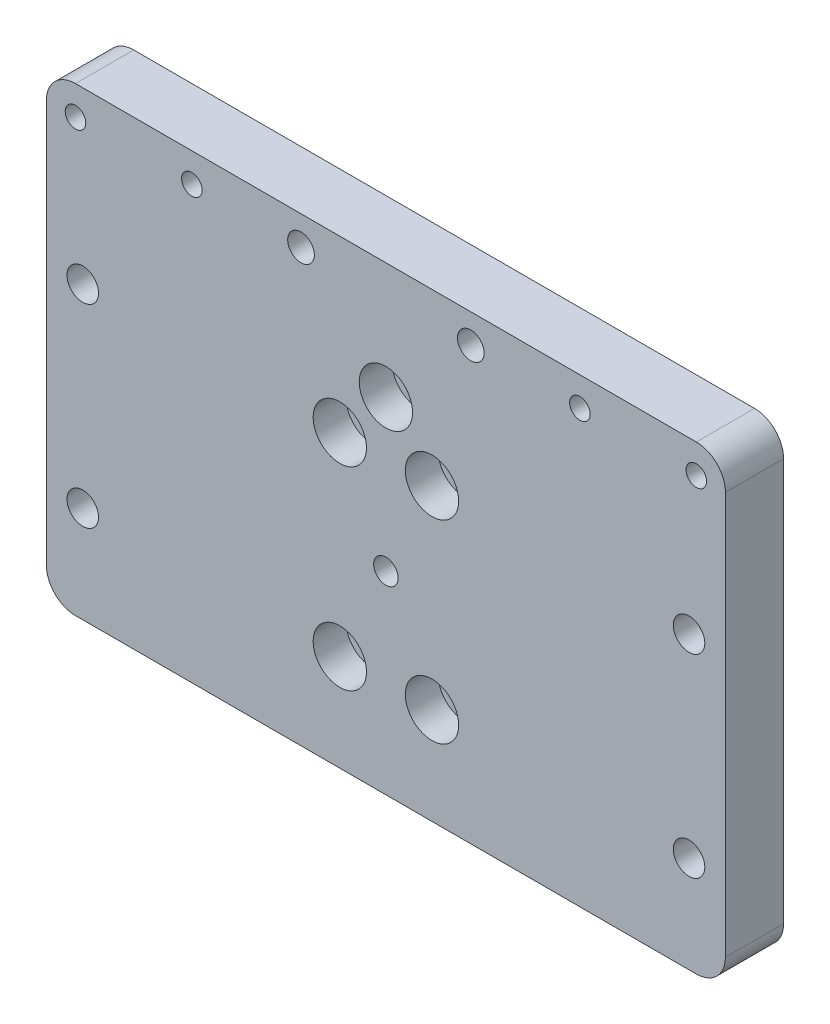
ISO-10303-21;
HEADER;
FILE_DESCRIPTION(('STEP AP214'),'2;1');
FILE_NAME('part.step','',(''),(''),'','','');
FILE_SCHEMA(('AUTOMOTIVE_DESIGN { 1 0 10303 214 1 1 1 1 }'));
ENDSEC;
DATA;
#1=APPLICATION_CONTEXT('core data for automotive mechanical design processes');
#2=APPLICATION_PROTOCOL_DEFINITION('international standard','automotive_design',2000,#1);
#3=PRODUCT_CONTEXT('',#1,'mechanical');
#4=PRODUCT('Part','Part','',(#3));
#5=PRODUCT_RELATED_PRODUCT_CATEGORY('part','',(#4));
#6=PRODUCT_DEFINITION_FORMATION('','',#4);
#7=PRODUCT_DEFINITION_CONTEXT('part definition',#1,'design');
#8=PRODUCT_DEFINITION('design','',#6,#7);
#9=PRODUCT_DEFINITION_SHAPE('','',#8);
#10=(LENGTH_UNIT() NAMED_UNIT(*) SI_UNIT(.MILLI.,.METRE.));
#11=(NAMED_UNIT(*) PLANE_ANGLE_UNIT() SI_UNIT($,.RADIAN.));
#12=(NAMED_UNIT(*) SI_UNIT($,.STERADIAN.) SOLID_ANGLE_UNIT());
#13=UNCERTAINTY_MEASURE_WITH_UNIT(LENGTH_MEASURE(1.E-05),#10,'distance_accuracy_value','');
#14=(GEOMETRIC_REPRESENTATION_CONTEXT(3) GLOBAL_UNCERTAINTY_ASSIGNED_CONTEXT((#13)) GLOBAL_UNIT_ASSIGNED_CONTEXT((#10,
#11,#12)) REPRESENTATION_CONTEXT('',''));
#15=CARTESIAN_POINT('',(0.,0.,0.));
#16=DIRECTION('',(0.,0.,1.));
#17=DIRECTION('',(1.,0.,0.));
#18=AXIS2_PLACEMENT_3D('',#15,#16,#17);
#19=CARTESIAN_POINT('',(2.37114451419452E-06,112.213628475702,51.0000000000025));
#20=DIRECTION('',(0.,0.,-1.));
#21=DIRECTION('',(-1.,0.,0.));
#22=AXIS2_PLACEMENT_3D('',#19,#20,#21);
#23=CYLINDRICAL_SURFACE('',#22,5.5);
#24=CARTESIAN_POINT('',(2.37114451427779E-06,112.213628475702,51.2000000000025));
#25=DIRECTION('',(0.,0.,-1.));
#26=DIRECTION('',(-1.,0.,0.));
#27=AXIS2_PLACEMENT_3D('',#24,#25,#26);
#28=CIRCLE('',#27,5.5);
#29=CARTESIAN_POINT('',(-5.49999762885549,112.213628475702,51.2000000000025));
#30=VERTEX_POINT('',#29);
#31=EDGE_CURVE('E19',#30,#30,#28,.F.);
#32=ORIENTED_EDGE('',*,*,#31,.F.);
#33=EDGE_LOOP('',(#32));
#34=FACE_BOUND('',#33,.T.);
#35=CARTESIAN_POINT('',(2.37114451710886E-06,112.213628475702,58.0000000000025));
#36=DIRECTION('',(0.,0.,-1.));
#37=DIRECTION('',(-1.,0.,0.));
#38=AXIS2_PLACEMENT_3D('',#35,#36,#37);
#39=CIRCLE('',#38,5.5);
#40=CARTESIAN_POINT('',(-5.49999762885548,112.213628475702,58.0000000000025));
#41=VERTEX_POINT('',#40);
#42=EDGE_CURVE('E243',#41,#41,#39,.T.);
#43=ORIENTED_EDGE('',*,*,#42,.F.);
#44=EDGE_LOOP('',(#43));
#45=FACE_BOUND('',#44,.T.);
#46=ADVANCED_FACE('F16',(#34,#45),#23,.F.);
#47=CARTESIAN_POINT('',(9.500000000003,61.1500000000002,56.0000000000026));
#48=DIRECTION('',(0.,0.,-1.));
#49=DIRECTION('',(-1.,0.,0.));
#50=AXIS2_PLACEMENT_3D('',#47,#48,#49);
#51=CYLINDRICAL_SURFACE('',#50,5.5);
#52=CARTESIAN_POINT('',(9.500000000003,61.1500000000002,51.2000000000026));
#53=DIRECTION('',(0.,0.,-1.));
#54=DIRECTION('',(-1.,0.,0.));
#55=AXIS2_PLACEMENT_3D('',#52,#53,#54);
#56=CIRCLE('',#55,5.5);
#57=CARTESIAN_POINT('',(4.000000000003,61.1500000000002,51.2000000000026));
#58=VERTEX_POINT('',#57);
#59=EDGE_CURVE('E251',#58,#58,#56,.F.);
#60=ORIENTED_EDGE('',*,*,#59,.F.);
#61=EDGE_LOOP('',(#60));
#62=FACE_BOUND('',#61,.T.);
#63=CARTESIAN_POINT('',(9.500000000003,61.1500000000002,58.0000000000026));
#64=DIRECTION('',(0.,0.,-1.));
#65=DIRECTION('',(-1.,0.,0.));
#66=AXIS2_PLACEMENT_3D('',#63,#64,#65);
#67=CIRCLE('',#66,5.5);
#68=CARTESIAN_POINT('',(4.000000000003,61.1500000000002,58.0000000000026));
#69=VERTEX_POINT('',#68);
#70=EDGE_CURVE('E237',#69,#69,#67,.T.);
#71=ORIENTED_EDGE('',*,*,#70,.F.);
#72=EDGE_LOOP('',(#71));
#73=FACE_BOUND('',#72,.T.);
#74=ADVANCED_FACE('F262',(#62,#73),#51,.F.);
#75=CARTESIAN_POINT('',(-9.50000000000292,101.15,56.0000000000026));
#76=DIRECTION('',(0.,0.,-1.));
#77=DIRECTION('',(-1.,0.,0.));
#78=AXIS2_PLACEMENT_3D('',#75,#76,#77);
#79=CYLINDRICAL_SURFACE('',#78,5.5);
#80=CARTESIAN_POINT('',(-9.50000000000292,101.15,51.2000000000026));
#81=DIRECTION('',(0.,0.,-1.));
#82=DIRECTION('',(-1.,0.,0.));
#83=AXIS2_PLACEMENT_3D('',#80,#81,#82);
#84=CIRCLE('',#83,5.5);
#85=CARTESIAN_POINT('',(-15.0000000000029,101.15,51.2000000000026));
#86=VERTEX_POINT('',#85);
#87=EDGE_CURVE('E249',#86,#86,#84,.F.);
#88=ORIENTED_EDGE('',*,*,#87,.F.);
#89=EDGE_LOOP('',(#88));
#90=FACE_BOUND('',#89,.T.);
#91=CARTESIAN_POINT('',(-9.50000000000292,101.15,58.0000000000026));
#92=DIRECTION('',(0.,0.,-1.));
#93=DIRECTION('',(-1.,0.,0.));
#94=AXIS2_PLACEMENT_3D('',#91,#92,#93);
#95=CIRCLE('',#94,5.5);
#96=CARTESIAN_POINT('',(-15.0000000000029,101.15,58.0000000000026));
#97=VERTEX_POINT('',#96);
#98=EDGE_CURVE('E234',#97,#97,#95,.T.);
#99=ORIENTED_EDGE('',*,*,#98,.F.);
#100=EDGE_LOOP('',(#99));
#101=FACE_BOUND('',#100,.T.);
#102=ADVANCED_FACE('F591',(#90,#101),#79,.F.);
#103=CARTESIAN_POINT('',(9.50000000000301,101.15,56.0000000000025));
#104=DIRECTION('',(0.,0.,-1.));
#105=DIRECTION('',(-1.,0.,0.));
#106=AXIS2_PLACEMENT_3D('',#103,#104,#105);
#107=CYLINDRICAL_SURFACE('',#106,5.5);
#108=CARTESIAN_POINT('',(9.50000000000301,101.15,51.2000000000025));
#109=DIRECTION('',(0.,0.,-1.));
#110=DIRECTION('',(-1.,0.,0.));
#111=AXIS2_PLACEMENT_3D('',#108,#109,#110);
#112=CIRCLE('',#111,5.5);
#113=CARTESIAN_POINT('',(4.00000000000301,101.15,51.2000000000025));
#114=VERTEX_POINT('',#113);
#115=EDGE_CURVE('E246',#114,#114,#112,.F.);
#116=ORIENTED_EDGE('',*,*,#115,.F.);
#117=EDGE_LOOP('',(#116));
#118=FACE_BOUND('',#117,.T.);
#119=CARTESIAN_POINT('',(9.50000000000301,101.15,58.0000000000026));
#120=DIRECTION('',(0.,0.,-1.));
#121=DIRECTION('',(-1.,0.,0.));
#122=AXIS2_PLACEMENT_3D('',#119,#120,#121);
#123=CIRCLE('',#122,5.5);
#124=CARTESIAN_POINT('',(4.00000000000301,101.15,58.0000000000026));
#125=VERTEX_POINT('',#124);
#126=EDGE_CURVE('E231',#125,#125,#123,.T.);
#127=ORIENTED_EDGE('',*,*,#126,.F.);
#128=EDGE_LOOP('',(#127));
#129=FACE_BOUND('',#128,.T.);
#130=ADVANCED_FACE('F582',(#118,#129),#107,.F.);
#131=CARTESIAN_POINT('',(-9.50000000000293,61.1500000000002,56.0000000000026));
#132=DIRECTION('',(0.,0.,-1.));
#133=DIRECTION('',(-1.,0.,0.));
#134=AXIS2_PLACEMENT_3D('',#131,#132,#133);
#135=CYLINDRICAL_SURFACE('',#134,5.5);
#136=CARTESIAN_POINT('',(-9.50000000000293,61.1500000000002,51.2000000000026));
#137=DIRECTION('',(0.,0.,-1.));
#138=DIRECTION('',(-1.,0.,0.));
#139=AXIS2_PLACEMENT_3D('',#136,#137,#138);
#140=CIRCLE('',#139,5.5);
#141=CARTESIAN_POINT('',(-15.0000000000029,61.1500000000002,51.2000000000026));
#142=VERTEX_POINT('',#141);
#143=EDGE_CURVE('E91',#142,#142,#140,.F.);
#144=ORIENTED_EDGE('',*,*,#143,.F.);
#145=EDGE_LOOP('',(#144));
#146=FACE_BOUND('',#145,.T.);
#147=CARTESIAN_POINT('',(-9.50000000000293,61.1500000000002,58.0000000000026));
#148=DIRECTION('',(0.,0.,-1.));
#149=DIRECTION('',(-1.,0.,0.));
#150=AXIS2_PLACEMENT_3D('',#147,#148,#149);
#151=CIRCLE('',#150,5.5);
#152=CARTESIAN_POINT('',(-15.0000000000029,61.1500000000002,58.0000000000026));
#153=VERTEX_POINT('',#152);
#154=EDGE_CURVE('E240',#153,#153,#151,.T.);
#155=ORIENTED_EDGE('',*,*,#154,.F.);
#156=EDGE_LOOP('',(#155));
#157=FACE_BOUND('',#156,.T.);
#158=ADVANCED_FACE('F573',(#146,#157),#135,.F.);
#159=CARTESIAN_POINT('',(0.,86.6818142378511,51.2000000000026));
#160=DIRECTION('',(0.,0.,1.));
#161=DIRECTION('',(0.,-1.,0.));
#162=AXIS2_PLACEMENT_3D('',#159,#160,#161);
#163=PLANE('',#162);
#164=CARTESIAN_POINT('',(2.37114451455141E-06,112.213628475702,51.2000000000025));
#165=DIRECTION('',(0.,0.,1.));
#166=DIRECTION('',(0.,-1.,0.));
#167=AXIS2_PLACEMENT_3D('',#164,#165,#166);
#168=CIRCLE('',#167,2.75);
#169=CARTESIAN_POINT('',(2.37114451455141E-06,109.463628475702,51.2000000000025));
#170=VERTEX_POINT('',#169);
#171=EDGE_CURVE('E220',#170,#170,#168,.F.);
#172=ORIENTED_EDGE('',*,*,#171,.T.);
#173=EDGE_LOOP('',(#172));
#174=FACE_BOUND('',#173,.T.);
#175=ORIENTED_EDGE('',*,*,#31,.T.);
#176=EDGE_LOOP('',(#175));
#177=FACE_BOUND('',#176,.T.);
#178=ADVANCED_FACE('F258',(#174,#177),#163,.T.);
#179=CARTESIAN_POINT('',(0.,86.6818142378511,51.2000000000026));
#180=DIRECTION('',(0.,0.,1.));
#181=DIRECTION('',(0.,-1.,0.));
#182=AXIS2_PLACEMENT_3D('',#179,#180,#181);
#183=PLANE('',#182);
#184=CARTESIAN_POINT('',(9.500000000003,61.1500000000002,51.2000000000026));
#185=DIRECTION('',(0.,0.,1.));
#186=DIRECTION('',(0.,-1.,0.));
#187=AXIS2_PLACEMENT_3D('',#184,#185,#186);
#188=CIRCLE('',#187,3.25);
#189=CARTESIAN_POINT('',(9.500000000003,57.9000000000002,51.2000000000026));
#190=VERTEX_POINT('',#189);
#191=EDGE_CURVE('E211',#190,#190,#188,.F.);
#192=ORIENTED_EDGE('',*,*,#191,.T.);
#193=EDGE_LOOP('',(#192));
#194=FACE_BOUND('',#193,.T.);
#195=ORIENTED_EDGE('',*,*,#59,.T.);
#196=EDGE_LOOP('',(#195));
#197=FACE_BOUND('',#196,.T.);
#198=ADVANCED_FACE('F556',(#194,#197),#183,.T.);
#199=CARTESIAN_POINT('',(0.,86.6818142378511,51.2000000000026));
#200=DIRECTION('',(0.,0.,1.));
#201=DIRECTION('',(0.,-1.,0.));
#202=AXIS2_PLACEMENT_3D('',#199,#200,#201);
#203=PLANE('',#202);
#204=CARTESIAN_POINT('',(-9.50000000000293,101.15,51.2000000000026));
#205=DIRECTION('',(0.,0.,1.));
#206=DIRECTION('',(0.,-1.,0.));
#207=AXIS2_PLACEMENT_3D('',#204,#205,#206);
#208=CIRCLE('',#207,3.25);
#209=CARTESIAN_POINT('',(-9.50000000000293,97.9,51.2000000000026));
#210=VERTEX_POINT('',#209);
#211=EDGE_CURVE('E196',#210,#210,#208,.F.);
#212=ORIENTED_EDGE('',*,*,#211,.T.);
#213=EDGE_LOOP('',(#212));
#214=FACE_BOUND('',#213,.T.);
#215=ORIENTED_EDGE('',*,*,#87,.T.);
#216=EDGE_LOOP('',(#215));
#217=FACE_BOUND('',#216,.T.);
#218=ADVANCED_FACE('F277',(#214,#217),#203,.T.);
#219=CARTESIAN_POINT('',(0.,86.6818142378511,51.2000000000026));
#220=DIRECTION('',(0.,0.,1.));
#221=DIRECTION('',(0.,-1.,0.));
#222=AXIS2_PLACEMENT_3D('',#219,#220,#221);
#223=PLANE('',#222);
#224=CARTESIAN_POINT('',(9.500000000003,101.15,51.2000000000025));
#225=DIRECTION('',(0.,0.,1.));
#226=DIRECTION('',(0.,-1.,0.));
#227=AXIS2_PLACEMENT_3D('',#224,#225,#226);
#228=CIRCLE('',#227,3.25);
#229=CARTESIAN_POINT('',(9.500000000003,97.9,51.2000000000025));
#230=VERTEX_POINT('',#229);
#231=EDGE_CURVE('E184',#230,#230,#228,.F.);
#232=ORIENTED_EDGE('',*,*,#231,.T.);
#233=EDGE_LOOP('',(#232));
#234=FACE_BOUND('',#233,.T.);
#235=ORIENTED_EDGE('',*,*,#115,.T.);
#236=EDGE_LOOP('',(#235));
#237=FACE_BOUND('',#236,.T.);
#238=ADVANCED_FACE('F267',(#234,#237),#223,.T.);
#239=CARTESIAN_POINT('',(2.37114450963889E-06,88.6819208628626,58.0000000000026));
#240=DIRECTION('',(0.,0.,1.));
#241=DIRECTION('',(0.,-1.,0.));
#242=AXIS2_PLACEMENT_3D('',#239,#240,#241);
#243=PLANE('',#242);
#244=CARTESIAN_POINT('',(62.500000000003,61.1500000000002,58.0000000000026));
#245=DIRECTION('',(0.,0.,1.));
#246=DIRECTION('',(0.,-1.,0.));
#247=AXIS2_PLACEMENT_3D('',#244,#245,#246);
#248=CIRCLE('',#247,3.25);
#249=CARTESIAN_POINT('',(62.500000000003,57.9000000000002,58.0000000000026));
#250=VERTEX_POINT('',#249);
#251=EDGE_CURVE('E178',#250,#250,#248,.F.);
#252=ORIENTED_EDGE('',*,*,#251,.T.);
#253=EDGE_LOOP('',(#252));
#254=FACE_BOUND('',#253,.T.);
#255=CARTESIAN_POINT('',(-39.9999976288555,130.213999908655,58.0000000000025));
#256=DIRECTION('',(0.,0.,1.));
#257=DIRECTION('',(0.,-1.,0.));
#258=AXIS2_PLACEMENT_3D('',#255,#256,#257);
#259=CIRCLE('',#258,2.117);
#260=CARTESIAN_POINT('',(-39.9999976288555,128.096999908655,58.0000000000025));
#261=VERTEX_POINT('',#260);
#262=EDGE_CURVE('E181',#261,#261,#259,.F.);
#263=ORIENTED_EDGE('',*,*,#262,.T.);
#264=EDGE_LOOP('',(#263));
#265=FACE_BOUND('',#264,.T.);
#266=CARTESIAN_POINT('',(40.0000023711445,130.213999908655,58.0000000000025));
#267=DIRECTION('',(0.,0.,1.));
#268=DIRECTION('',(0.,-1.,0.));
#269=AXIS2_PLACEMENT_3D('',#266,#267,#268);
#270=CIRCLE('',#269,2.117);
#271=CARTESIAN_POINT('',(40.0000023711445,128.096999908655,58.0000000000025));
#272=VERTEX_POINT('',#271);
#273=EDGE_CURVE('E187',#272,#272,#270,.F.);
#274=ORIENTED_EDGE('',*,*,#273,.T.);
#275=EDGE_LOOP('',(#274));
#276=FACE_BOUND('',#275,.T.);
#277=CARTESIAN_POINT('',(-62.5000000000029,61.1500000000002,58.0000000000026));
#278=DIRECTION('',(0.,0.,1.));
#279=DIRECTION('',(0.,-1.,0.));
#280=AXIS2_PLACEMENT_3D('',#277,#278,#279);
#281=CIRCLE('',#280,3.25);
#282=CARTESIAN_POINT('',(-62.5000000000029,57.9000000000002,58.0000000000026));
#283=VERTEX_POINT('',#282);
#284=EDGE_CURVE('E190',#283,#283,#281,.F.);
#285=ORIENTED_EDGE('',*,*,#284,.T.);
#286=EDGE_LOOP('',(#285));
#287=FACE_BOUND('',#286,.T.);
#288=CARTESIAN_POINT('',(-63.9999976288555,130.2139998831,58.0000000000026));
#289=DIRECTION('',(0.,0.,1.));
#290=DIRECTION('',(0.,-1.,0.));
#291=AXIS2_PLACEMENT_3D('',#288,#289,#290);
#292=CIRCLE('',#291,2.117);
#293=CARTESIAN_POINT('',(-63.9999976288555,128.0969998831,58.0000000000026));
#294=VERTEX_POINT('',#293);
#295=EDGE_CURVE('E193',#294,#294,#292,.F.);
#296=ORIENTED_EDGE('',*,*,#295,.T.);
#297=EDGE_LOOP('',(#296));
#298=FACE_BOUND('',#297,.T.);
#299=CARTESIAN_POINT('',(62.500000000003,101.15,58.0000000000025));
#300=DIRECTION('',(0.,0.,1.));
#301=DIRECTION('',(0.,-1.,0.));
#302=AXIS2_PLACEMENT_3D('',#299,#300,#301);
#303=CIRCLE('',#302,3.25);
#304=CARTESIAN_POINT('',(62.500000000003,97.9,58.0000000000025));
#305=VERTEX_POINT('',#304);
#306=EDGE_CURVE('E199',#305,#305,#303,.F.);
#307=ORIENTED_EDGE('',*,*,#306,.T.);
#308=EDGE_LOOP('',(#307));
#309=FACE_BOUND('',#308,.T.);
#310=CARTESIAN_POINT('',(-62.5000000000029,101.15,58.0000000000026));
#311=DIRECTION('',(0.,0.,1.));
#312=DIRECTION('',(0.,-1.,0.));
#313=AXIS2_PLACEMENT_3D('',#310,#311,#312);
#314=CIRCLE('',#313,3.25);
#315=CARTESIAN_POINT('',(-62.5000000000029,97.9,58.0000000000026));
#316=VERTEX_POINT('',#315);
#317=EDGE_CURVE('E202',#316,#316,#314,.F.);
#318=ORIENTED_EDGE('',*,*,#317,.T.);
#319=EDGE_LOOP('',(#318));
#320=FACE_BOUND('',#319,.T.);
#321=CARTESIAN_POINT('',(2.37114451325673E-06,81.1502132500234,58.0000000000026));
#322=DIRECTION('',(0.,0.,1.));
#323=DIRECTION('',(0.,-1.,0.));
#324=AXIS2_PLACEMENT_3D('',#321,#322,#323);
#325=CIRCLE('',#324,2.5175);
#326=CARTESIAN_POINT('',(2.37114451325673E-06,78.6327132500234,58.0000000000026));
#327=VERTEX_POINT('',#326);
#328=EDGE_CURVE('E205',#327,#327,#325,.F.);
#329=ORIENTED_EDGE('',*,*,#328,.T.);
#330=EDGE_LOOP('',(#329));
#331=FACE_BOUND('',#330,.T.);
#332=CARTESIAN_POINT('',(64.0000023711445,130.2139998831,58.0000000000025));
#333=DIRECTION('',(0.,0.,1.));
#334=DIRECTION('',(0.,-1.,0.));
#335=AXIS2_PLACEMENT_3D('',#332,#333,#334);
#336=CIRCLE('',#335,2.117);
#337=CARTESIAN_POINT('',(64.0000023711445,128.0969998831,58.0000000000025));
#338=VERTEX_POINT('',#337);
#339=EDGE_CURVE('E208',#338,#338,#336,.F.);
#340=ORIENTED_EDGE('',*,*,#339,.T.);
#341=EDGE_LOOP('',(#340));
#342=FACE_BOUND('',#341,.T.);
#343=ORIENTED_EDGE('',*,*,#126,.T.);
#344=EDGE_LOOP('',(#343));
#345=FACE_BOUND('',#344,.T.);
#346=ORIENTED_EDGE('',*,*,#98,.T.);
#347=EDGE_LOOP('',(#346));
#348=FACE_BOUND('',#347,.T.);
#349=ORIENTED_EDGE('',*,*,#70,.T.);
#350=EDGE_LOOP('',(#349));
#351=FACE_BOUND('',#350,.T.);
#352=ORIENTED_EDGE('',*,*,#154,.T.);
#353=EDGE_LOOP('',(#352));
#354=FACE_BOUND('',#353,.T.);
#355=CARTESIAN_POINT('',(17.5000023711445,130.213628475702,58.0000000000025));
#356=DIRECTION('',(0.,0.,1.));
#357=DIRECTION('',(0.,-1.,0.));
#358=AXIS2_PLACEMENT_3D('',#355,#356,#357);
#359=CIRCLE('',#358,2.75);
#360=CARTESIAN_POINT('',(17.5000023711445,127.463628475702,58.0000000000025));
#361=VERTEX_POINT('',#360);
#362=EDGE_CURVE('E214',#361,#361,#359,.F.);
#363=ORIENTED_EDGE('',*,*,#362,.T.);
#364=EDGE_LOOP('',(#363));
#365=FACE_BOUND('',#364,.T.);
#366=CARTESIAN_POINT('',(-17.4999976288555,130.213628475702,58.0000000000025));
#367=DIRECTION('',(0.,0.,1.));
#368=DIRECTION('',(0.,-1.,0.));
#369=AXIS2_PLACEMENT_3D('',#366,#367,#368);
#370=CIRCLE('',#369,2.75);
#371=CARTESIAN_POINT('',(-17.4999976288555,127.463628475702,58.0000000000025));
#372=VERTEX_POINT('',#371);
#373=EDGE_CURVE('E217',#372,#372,#370,.F.);
#374=ORIENTED_EDGE('',*,*,#373,.T.);
#375=EDGE_LOOP('',(#374));
#376=FACE_BOUND('',#375,.T.);
#377=ORIENTED_EDGE('',*,*,#42,.T.);
#378=EDGE_LOOP('',(#377));
#379=FACE_BOUND('',#378,.T.);
#380=CARTESIAN_POINT('',(-63.9999976288555,47.2132132500234,58.0000000000026));
#381=DIRECTION('',(0.,0.,-1.));
#382=DIRECTION('',(0.,1.,0.));
#383=AXIS2_PLACEMENT_3D('',#380,#381,#382);
#384=CIRCLE('',#383,6.);
#385=CARTESIAN_POINT('',(-63.9999976288555,41.2132132500234,58.0000000000026));
#386=VERTEX_POINT('',#385);
#387=CARTESIAN_POINT('',(-69.9999976288555,47.2132132500234,58.0000000000026));
#388=VERTEX_POINT('',#387);
#389=EDGE_CURVE('E225',#386,#388,#384,.T.);
#390=ORIENTED_EDGE('',*,*,#389,.F.);
#391=DIRECTION('',(1.,0.,0.));
#392=VECTOR('',#391,1.);
#393=CARTESIAN_POINT('',(-69.9999976288555,41.2132132500234,58.0000000000026));
#394=LINE('',#393,#392);
#395=CARTESIAN_POINT('',(64.0000023711446,41.2132132500234,58.0000000000026));
#396=VERTEX_POINT('',#395);
#397=EDGE_CURVE('E107',#396,#386,#394,.F.);
#398=ORIENTED_EDGE('',*,*,#397,.F.);
#399=CARTESIAN_POINT('',(64.0000023711446,47.2132132500234,58.0000000000026));
#400=DIRECTION('',(0.,0.,1.));
#401=DIRECTION('',(0.,-1.,0.));
#402=AXIS2_PLACEMENT_3D('',#399,#400,#401);
#403=CIRCLE('',#402,6.);
#404=CARTESIAN_POINT('',(70.0000023711446,47.2132132500234,58.0000000000026));
#405=VERTEX_POINT('',#404);
#406=EDGE_CURVE('E85',#405,#396,#403,.F.);
#407=ORIENTED_EDGE('',*,*,#406,.F.);
#408=DIRECTION('',(0.,1.,0.));
#409=VECTOR('',#408,1.);
#410=CARTESIAN_POINT('',(70.0000023711446,41.1502132500234,58.0000000000025));
#411=LINE('',#410,#409);
#412=CARTESIAN_POINT('',(70.0000023711445,130.213628475702,58.0000000000025));
#413=VERTEX_POINT('',#412);
#414=EDGE_CURVE('E81',#413,#405,#411,.F.);
#415=ORIENTED_EDGE('',*,*,#414,.F.);
#416=CARTESIAN_POINT('',(64.0000023711445,130.213628475702,58.0000000000025));
#417=DIRECTION('',(0.,0.,1.));
#418=DIRECTION('',(0.,-1.,0.));
#419=AXIS2_PLACEMENT_3D('',#416,#417,#418);
#420=CIRCLE('',#419,6.);
#421=CARTESIAN_POINT('',(64.0000023711445,136.213628475702,58.0000000000025));
#422=VERTEX_POINT('',#421);
#423=EDGE_CURVE('E78',#422,#413,#420,.F.);
#424=ORIENTED_EDGE('',*,*,#423,.F.);
#425=DIRECTION('',(1.,0.,0.));
#426=VECTOR('',#425,1.);
#427=CARTESIAN_POINT('',(70.0000023711445,136.213628475702,58.0000000000025));
#428=LINE('',#427,#426);
#429=CARTESIAN_POINT('',(-63.9999976288555,136.213628475702,58.0000000000025));
#430=VERTEX_POINT('',#429);
#431=EDGE_CURVE('E115',#430,#422,#428,.T.);
#432=ORIENTED_EDGE('',*,*,#431,.F.);
#433=CARTESIAN_POINT('',(-63.9999976288555,130.213628475702,58.0000000000025));
#434=DIRECTION('',(0.,0.,1.));
#435=DIRECTION('',(0.,-1.,0.));
#436=AXIS2_PLACEMENT_3D('',#433,#434,#435);
#437=CIRCLE('',#436,6.);
#438=CARTESIAN_POINT('',(-69.9999976288555,130.213628475702,58.0000000000026));
#439=VERTEX_POINT('',#438);
#440=EDGE_CURVE('E114',#439,#430,#437,.F.);
#441=ORIENTED_EDGE('',*,*,#440,.F.);
#442=DIRECTION('',(0.,1.,0.));
#443=VECTOR('',#442,1.);
#444=CARTESIAN_POINT('',(-69.9999976288555,136.213628475702,58.0000000000026));
#445=LINE('',#444,#443);
#446=EDGE_CURVE('E111',#388,#439,#445,.T.);
#447=ORIENTED_EDGE('',*,*,#446,.F.);
#448=EDGE_LOOP('',(#390,#398,#407,#415,#424,#432,#441,#447));
#449=FACE_BOUND('',#448,.T.);
#450=ADVANCED_FACE('F83',(#254,#265,#276,#287,#298,#309,#320,#331,#342,#345,#348,#351,#354,#365,
#376,#379,#449),#243,.T.);
#451=CARTESIAN_POINT('',(0.,86.6818142378511,51.2000000000026));
#452=DIRECTION('',(0.,0.,1.));
#453=DIRECTION('',(0.,-1.,0.));
#454=AXIS2_PLACEMENT_3D('',#451,#452,#453);
#455=PLANE('',#454);
#456=CARTESIAN_POINT('',(-9.50000000000293,61.1500000000002,51.2000000000026));
#457=DIRECTION('',(0.,0.,1.));
#458=DIRECTION('',(0.,-1.,0.));
#459=AXIS2_PLACEMENT_3D('',#456,#457,#458);
#460=CIRCLE('',#459,3.25);
#461=CARTESIAN_POINT('',(-9.50000000000293,57.9000000000002,51.2000000000026));
#462=VERTEX_POINT('',#461);
#463=EDGE_CURVE('E175',#462,#462,#460,.F.);
#464=ORIENTED_EDGE('',*,*,#463,.T.);
#465=EDGE_LOOP('',(#464));
#466=FACE_BOUND('',#465,.T.);
#467=ORIENTED_EDGE('',*,*,#143,.T.);
#468=EDGE_LOOP('',(#467));
#469=FACE_BOUND('',#468,.T.);
#470=ADVANCED_FACE('F266',(#466,#469),#455,.T.);
#471=CARTESIAN_POINT('',(70.0000023711446,41.1502132500234,46.0000000000026));
#472=DIRECTION('',(1.,0.,0.));
#473=DIRECTION('',(0.,1.,0.));
#474=AXIS2_PLACEMENT_3D('',#471,#472,#473);
#475=PLANE('',#474);
#476=DIRECTION('',(0.,0.,1.));
#477=VECTOR('',#476,1.);
#478=CARTESIAN_POINT('',(70.0000023711445,130.213628475702,46.0000000000025));
#479=LINE('',#478,#477);
#480=CARTESIAN_POINT('',(70.0000023711446,130.213628475702,46.0000000000025));
#481=VERTEX_POINT('',#480);
#482=EDGE_CURVE('E90',#413,#481,#479,.F.);
#483=ORIENTED_EDGE('',*,*,#482,.F.);
#484=ORIENTED_EDGE('',*,*,#414,.T.);
#485=DIRECTION('',(0.,0.,1.));
#486=VECTOR('',#485,1.);
#487=CARTESIAN_POINT('',(70.0000023711446,47.2132132500234,46.0000000000026));
#488=LINE('',#487,#486);
#489=CARTESIAN_POINT('',(70.0000023711446,47.2132132500234,46.0000000000026));
#490=VERTEX_POINT('',#489);
#491=EDGE_CURVE('E223',#490,#405,#488,.T.);
#492=ORIENTED_EDGE('',*,*,#491,.F.);
#493=DIRECTION('',(0.,-1.,0.));
#494=VECTOR('',#493,1.);
#495=CARTESIAN_POINT('',(70.0000023711446,88.6819208628626,46.0000000000026));
#496=LINE('',#495,#494);
#497=EDGE_CURVE('E102',#490,#481,#496,.F.);
#498=ORIENTED_EDGE('',*,*,#497,.T.);
#499=EDGE_LOOP('',(#483,#484,#492,#498));
#500=FACE_BOUND('',#499,.T.);
#501=ADVANCED_FACE('F101',(#500),#475,.T.);
#502=CARTESIAN_POINT('',(64.0000023711445,130.213628475702,46.0000000000025));
#503=DIRECTION('',(0.,0.,1.));
#504=DIRECTION('',(0.,-1.,0.));
#505=AXIS2_PLACEMENT_3D('',#502,#503,#504);
#506=CYLINDRICAL_SURFACE('',#505,6.);
#507=DIRECTION('',(0.,0.,1.));
#508=VECTOR('',#507,1.);
#509=CARTESIAN_POINT('',(64.0000023711445,136.213628475702,46.0000000000025));
#510=LINE('',#509,#508);
#511=CARTESIAN_POINT('',(64.0000023711445,136.213628475702,46.0000000000025));
#512=VERTEX_POINT('',#511);
#513=EDGE_CURVE('E98',#422,#512,#510,.F.);
#514=ORIENTED_EDGE('',*,*,#513,.F.);
#515=ORIENTED_EDGE('',*,*,#423,.T.);
#516=ORIENTED_EDGE('',*,*,#482,.T.);
#517=CARTESIAN_POINT('',(64.0000023711445,130.213628475702,46.0000000000025));
#518=DIRECTION('',(0.,0.,1.));
#519=DIRECTION('',(0.,-1.,0.));
#520=AXIS2_PLACEMENT_3D('',#517,#518,#519);
#521=CIRCLE('',#520,6.);
#522=EDGE_CURVE('E173',#481,#512,#521,.T.);
#523=ORIENTED_EDGE('',*,*,#522,.T.);
#524=EDGE_LOOP('',(#514,#515,#516,#523));
#525=FACE_BOUND('',#524,.T.);
#526=ADVANCED_FACE('F95',(#525),#506,.T.);
#527=CARTESIAN_POINT('',(70.0000023711445,136.213628475702,46.0000000000025));
#528=DIRECTION('',(0.,1.,0.));
#529=DIRECTION('',(0.,0.,1.));
#530=AXIS2_PLACEMENT_3D('',#527,#528,#529);
#531=PLANE('',#530);
#532=DIRECTION('',(0.,0.,1.));
#533=VECTOR('',#532,1.);
#534=CARTESIAN_POINT('',(-63.9999976288555,136.213628475702,46.0000000000025));
#535=LINE('',#534,#533);
#536=CARTESIAN_POINT('',(-63.9999976288555,136.213628475702,46.0000000000025));
#537=VERTEX_POINT('',#536);
#538=EDGE_CURVE('E116',#430,#537,#535,.F.);
#539=ORIENTED_EDGE('',*,*,#538,.F.);
#540=ORIENTED_EDGE('',*,*,#431,.T.);
#541=ORIENTED_EDGE('',*,*,#513,.T.);
#542=DIRECTION('',(1.,0.,0.));
#543=VECTOR('',#542,1.);
#544=CARTESIAN_POINT('',(2.37114450408777E-06,136.213628475702,46.0000000000026));
#545=LINE('',#544,#543);
#546=EDGE_CURVE('E172',#512,#537,#545,.F.);
#547=ORIENTED_EDGE('',*,*,#546,.T.);
#548=EDGE_LOOP('',(#539,#540,#541,#547));
#549=FACE_BOUND('',#548,.T.);
#550=ADVANCED_FACE('F372',(#549),#531,.T.);
#551=CARTESIAN_POINT('',(-63.9999976288555,130.213628475702,46.0000000000025));
#552=DIRECTION('',(0.,0.,1.));
#553=DIRECTION('',(0.,-1.,0.));
#554=AXIS2_PLACEMENT_3D('',#551,#552,#553);
#555=CYLINDRICAL_SURFACE('',#554,6.);
#556=DIRECTION('',(0.,0.,1.));
#557=VECTOR('',#556,1.);
#558=CARTESIAN_POINT('',(-69.9999976288555,130.213628475702,46.0000000000025));
#559=LINE('',#558,#557);
#560=CARTESIAN_POINT('',(-69.9999976288555,130.213628475702,46.0000000000025));
#561=VERTEX_POINT('',#560);
#562=EDGE_CURVE('E113',#439,#561,#559,.F.);
#563=ORIENTED_EDGE('',*,*,#562,.F.);
#564=ORIENTED_EDGE('',*,*,#440,.T.);
#565=ORIENTED_EDGE('',*,*,#538,.T.);
#566=CARTESIAN_POINT('',(-63.9999976288555,130.213628475702,46.0000000000025));
#567=DIRECTION('',(0.,0.,1.));
#568=DIRECTION('',(0.,-1.,0.));
#569=AXIS2_PLACEMENT_3D('',#566,#567,#568);
#570=CIRCLE('',#569,6.);
#571=EDGE_CURVE('E169',#537,#561,#570,.T.);
#572=ORIENTED_EDGE('',*,*,#571,.T.);
#573=EDGE_LOOP('',(#563,#564,#565,#572));
#574=FACE_BOUND('',#573,.T.);
#575=ADVANCED_FACE('F368',(#574),#555,.T.);
#576=CARTESIAN_POINT('',(-69.9999976288555,136.213628475702,46.0000000000025));
#577=DIRECTION('',(-1.,0.,0.));
#578=DIRECTION('',(0.,0.,1.));
#579=AXIS2_PLACEMENT_3D('',#576,#577,#578);
#580=PLANE('',#579);
#581=ORIENTED_EDGE('',*,*,#562,.T.);
#582=DIRECTION('',(0.,-1.,0.));
#583=VECTOR('',#582,1.);
#584=CARTESIAN_POINT('',(-69.9999976288555,88.6819208628626,46.0000000000026));
#585=LINE('',#584,#583);
#586=CARTESIAN_POINT('',(-69.9999976288555,47.2132132500234,46.0000000000026));
#587=VERTEX_POINT('',#586);
#588=EDGE_CURVE('E168',#561,#587,#585,.T.);
#589=ORIENTED_EDGE('',*,*,#588,.T.);
#590=DIRECTION('',(0.,0.,-1.));
#591=VECTOR('',#590,1.);
#592=CARTESIAN_POINT('',(-69.9999976288555,47.2132132500234,46.0000000000026));
#593=LINE('',#592,#591);
#594=EDGE_CURVE('E110',#388,#587,#593,.T.);
#595=ORIENTED_EDGE('',*,*,#594,.F.);
#596=ORIENTED_EDGE('',*,*,#446,.T.);
#597=EDGE_LOOP('',(#581,#589,#595,#596));
#598=FACE_BOUND('',#597,.T.);
#599=ADVANCED_FACE('F364',(#598),#580,.T.);
#600=CARTESIAN_POINT('',(-63.9999976288555,47.2132132500234,46.0000000000026));
#601=DIRECTION('',(0.,0.,-1.));
#602=DIRECTION('',(0.,1.,0.));
#603=AXIS2_PLACEMENT_3D('',#600,#601,#602);
#604=CYLINDRICAL_SURFACE('',#603,6.);
#605=ORIENTED_EDGE('',*,*,#389,.T.);
#606=ORIENTED_EDGE('',*,*,#594,.T.);
#607=CARTESIAN_POINT('',(-63.9999976288555,47.2132132500234,46.0000000000026));
#608=DIRECTION('',(0.,0.,-1.));
#609=DIRECTION('',(0.,1.,0.));
#610=AXIS2_PLACEMENT_3D('',#607,#608,#609);
#611=CIRCLE('',#610,6.);
#612=CARTESIAN_POINT('',(-63.9999976288555,41.2132132500234,46.0000000000026));
#613=VERTEX_POINT('',#612);
#614=EDGE_CURVE('E165',#587,#613,#611,.F.);
#615=ORIENTED_EDGE('',*,*,#614,.T.);
#616=DIRECTION('',(0.,0.,-1.));
#617=VECTOR('',#616,1.);
#618=CARTESIAN_POINT('',(-63.9999976288555,41.2132132500234,46.0000000000026));
#619=LINE('',#618,#617);
#620=EDGE_CURVE('E109',#386,#613,#619,.T.);
#621=ORIENTED_EDGE('',*,*,#620,.F.);
#622=EDGE_LOOP('',(#605,#606,#615,#621));
#623=FACE_BOUND('',#622,.T.);
#624=ADVANCED_FACE('F360',(#623),#604,.T.);
#625=CARTESIAN_POINT('',(-69.9999976288555,41.2132132500234,46.0000000000026));
#626=DIRECTION('',(0.,-1.,0.));
#627=DIRECTION('',(0.,0.,-1.));
#628=AXIS2_PLACEMENT_3D('',#625,#626,#627);
#629=PLANE('',#628);
#630=ORIENTED_EDGE('',*,*,#620,.T.);
#631=DIRECTION('',(1.,0.,0.));
#632=VECTOR('',#631,1.);
#633=CARTESIAN_POINT('',(2.37114450408777E-06,41.2132132500234,46.0000000000027));
#634=LINE('',#633,#632);
#635=CARTESIAN_POINT('',(64.0000023711446,41.2132132500234,46.0000000000026));
#636=VERTEX_POINT('',#635);
#637=EDGE_CURVE('E164',#613,#636,#634,.T.);
#638=ORIENTED_EDGE('',*,*,#637,.T.);
#639=DIRECTION('',(0.,0.,1.));
#640=VECTOR('',#639,1.);
#641=CARTESIAN_POINT('',(64.0000023711446,41.2132132500234,46.0000000000026));
#642=LINE('',#641,#640);
#643=EDGE_CURVE('E34',#396,#636,#642,.F.);
#644=ORIENTED_EDGE('',*,*,#643,.F.);
#645=ORIENTED_EDGE('',*,*,#397,.T.);
#646=EDGE_LOOP('',(#630,#638,#644,#645));
#647=FACE_BOUND('',#646,.T.);
#648=ADVANCED_FACE('F357',(#647),#629,.T.);
#649=CARTESIAN_POINT('',(64.0000023711446,47.2132132500234,46.0000000000026));
#650=DIRECTION('',(0.,0.,1.));
#651=DIRECTION('',(0.,-1.,0.));
#652=AXIS2_PLACEMENT_3D('',#649,#650,#651);
#653=CYLINDRICAL_SURFACE('',#652,6.);
#654=CARTESIAN_POINT('',(64.0000023711446,47.2132132500234,46.0000000000026));
#655=DIRECTION('',(0.,0.,1.));
#656=DIRECTION('',(0.,-1.,0.));
#657=AXIS2_PLACEMENT_3D('',#654,#655,#656);
#658=CIRCLE('',#657,6.);
#659=EDGE_CURVE('E162',#636,#490,#658,.T.);
#660=ORIENTED_EDGE('',*,*,#659,.T.);
#661=ORIENTED_EDGE('',*,*,#491,.T.);
#662=ORIENTED_EDGE('',*,*,#406,.T.);
#663=ORIENTED_EDGE('',*,*,#643,.T.);
#664=EDGE_LOOP('',(#660,#661,#662,#663));
#665=FACE_BOUND('',#664,.T.);
#666=ADVANCED_FACE('F353',(#665),#653,.T.);
#667=CARTESIAN_POINT('',(2.37114451281946E-06,112.213628475702,46.0000000000025));
#668=DIRECTION('',(0.,0.,1.));
#669=DIRECTION('',(0.,-1.,0.));
#670=AXIS2_PLACEMENT_3D('',#667,#668,#669);
#671=CYLINDRICAL_SURFACE('',#670,2.75);
#672=ORIENTED_EDGE('',*,*,#171,.F.);
#673=EDGE_LOOP('',(#672));
#674=FACE_BOUND('',#673,.T.);
#675=CARTESIAN_POINT('',(2.37114451281946E-06,112.213628475702,46.0000000000025));
#676=DIRECTION('',(0.,0.,1.));
#677=DIRECTION('',(0.,-1.,0.));
#678=AXIS2_PLACEMENT_3D('',#675,#676,#677);
#679=CIRCLE('',#678,2.75);
#680=CARTESIAN_POINT('',(2.37114451281946E-06,109.463628475702,46.0000000000025));
#681=VERTEX_POINT('',#680);
#682=EDGE_CURVE('E159',#681,#681,#679,.F.);
#683=ORIENTED_EDGE('',*,*,#682,.T.);
#684=EDGE_LOOP('',(#683));
#685=FACE_BOUND('',#684,.T.);
#686=ADVANCED_FACE('F349',(#674,#685),#671,.F.);
#687=CARTESIAN_POINT('',(-17.4999976288555,130.213628475702,46.0000000000025));
#688=DIRECTION('',(0.,0.,1.));
#689=DIRECTION('',(0.,-1.,0.));
#690=AXIS2_PLACEMENT_3D('',#687,#688,#689);
#691=CYLINDRICAL_SURFACE('',#690,2.75);
#692=ORIENTED_EDGE('',*,*,#373,.F.);
#693=EDGE_LOOP('',(#692));
#694=FACE_BOUND('',#693,.T.);
#695=CARTESIAN_POINT('',(-17.4999976288555,130.213628475702,46.0000000000025));
#696=DIRECTION('',(0.,0.,1.));
#697=DIRECTION('',(0.,-1.,0.));
#698=AXIS2_PLACEMENT_3D('',#695,#696,#697);
#699=CIRCLE('',#698,2.75);
#700=CARTESIAN_POINT('',(-17.4999976288555,127.463628475702,46.0000000000025));
#701=VERTEX_POINT('',#700);
#702=EDGE_CURVE('E156',#701,#701,#699,.F.);
#703=ORIENTED_EDGE('',*,*,#702,.T.);
#704=EDGE_LOOP('',(#703));
#705=FACE_BOUND('',#704,.T.);
#706=ADVANCED_FACE('F345',(#694,#705),#691,.F.);
#707=CARTESIAN_POINT('',(17.5000023711445,130.213628475702,46.0000000000025));
#708=DIRECTION('',(0.,0.,1.));
#709=DIRECTION('',(0.,-1.,0.));
#710=AXIS2_PLACEMENT_3D('',#707,#708,#709);
#711=CYLINDRICAL_SURFACE('',#710,2.75);
#712=ORIENTED_EDGE('',*,*,#362,.F.);
#713=EDGE_LOOP('',(#712));
#714=FACE_BOUND('',#713,.T.);
#715=CARTESIAN_POINT('',(17.5000023711445,130.213628475702,46.0000000000025));
#716=DIRECTION('',(0.,0.,1.));
#717=DIRECTION('',(0.,-1.,0.));
#718=AXIS2_PLACEMENT_3D('',#715,#716,#717);
#719=CIRCLE('',#718,2.75);
#720=CARTESIAN_POINT('',(17.5000023711445,127.463628475702,46.0000000000025));
#721=VERTEX_POINT('',#720);
#722=EDGE_CURVE('E153',#721,#721,#719,.F.);
#723=ORIENTED_EDGE('',*,*,#722,.T.);
#724=EDGE_LOOP('',(#723));
#725=FACE_BOUND('',#724,.T.);
#726=ADVANCED_FACE('F341',(#714,#725),#711,.F.);
#727=CARTESIAN_POINT('',(9.500000000003,61.1500000000002,46.0000000000026));
#728=DIRECTION('',(0.,0.,1.));
#729=DIRECTION('',(0.,-1.,0.));
#730=AXIS2_PLACEMENT_3D('',#727,#728,#729);
#731=CYLINDRICAL_SURFACE('',#730,3.25);
#732=CARTESIAN_POINT('',(9.500000000003,61.1500000000002,46.0000000000026));
#733=DIRECTION('',(0.,0.,1.));
#734=DIRECTION('',(0.,-1.,0.));
#735=AXIS2_PLACEMENT_3D('',#732,#733,#734);
#736=CIRCLE('',#735,3.25);
#737=CARTESIAN_POINT('',(9.500000000003,57.9000000000002,46.0000000000026));
#738=VERTEX_POINT('',#737);
#739=EDGE_CURVE('E150',#738,#738,#736,.F.);
#740=ORIENTED_EDGE('',*,*,#739,.T.);
#741=EDGE_LOOP('',(#740));
#742=FACE_BOUND('',#741,.T.);
#743=ORIENTED_EDGE('',*,*,#191,.F.);
#744=EDGE_LOOP('',(#743));
#745=FACE_BOUND('',#744,.T.);
#746=ADVANCED_FACE('F337',(#742,#745),#731,.F.);
#747=CARTESIAN_POINT('',(64.0000023711445,130.2139998831,46.0000000000025));
#748=DIRECTION('',(0.,0.,1.));
#749=DIRECTION('',(0.,-1.,0.));
#750=AXIS2_PLACEMENT_3D('',#747,#748,#749);
#751=CYLINDRICAL_SURFACE('',#750,2.117);
#752=CARTESIAN_POINT('',(64.0000023711445,130.2139998831,46.0000000000025));
#753=DIRECTION('',(0.,0.,1.));
#754=DIRECTION('',(0.,-1.,0.));
#755=AXIS2_PLACEMENT_3D('',#752,#753,#754);
#756=CIRCLE('',#755,2.117);
#757=CARTESIAN_POINT('',(64.0000023711445,128.0969998831,46.0000000000025));
#758=VERTEX_POINT('',#757);
#759=EDGE_CURVE('E147',#758,#758,#756,.F.);
#760=ORIENTED_EDGE('',*,*,#759,.T.);
#761=EDGE_LOOP('',(#760));
#762=FACE_BOUND('',#761,.T.);
#763=ORIENTED_EDGE('',*,*,#339,.F.);
#764=EDGE_LOOP('',(#763));
#765=FACE_BOUND('',#764,.T.);
#766=ADVANCED_FACE('F333',(#762,#765),#751,.F.);
#767=CARTESIAN_POINT('',(2.37114450792766E-06,81.1502132500234,46.0000000000026));
#768=DIRECTION('',(0.,0.,1.));
#769=DIRECTION('',(0.,-1.,0.));
#770=AXIS2_PLACEMENT_3D('',#767,#768,#769);
#771=CYLINDRICAL_SURFACE('',#770,2.5175);
#772=CARTESIAN_POINT('',(2.37114450792766E-06,81.1502132500234,46.0000000000026));
#773=DIRECTION('',(0.,0.,1.));
#774=DIRECTION('',(0.,-1.,0.));
#775=AXIS2_PLACEMENT_3D('',#772,#773,#774);
#776=CIRCLE('',#775,2.5175);
#777=CARTESIAN_POINT('',(2.37114450792766E-06,78.6327132500234,46.0000000000026));
#778=VERTEX_POINT('',#777);
#779=EDGE_CURVE('E144',#778,#778,#776,.F.);
#780=ORIENTED_EDGE('',*,*,#779,.T.);
#781=EDGE_LOOP('',(#780));
#782=FACE_BOUND('',#781,.T.);
#783=ORIENTED_EDGE('',*,*,#328,.F.);
#784=EDGE_LOOP('',(#783));
#785=FACE_BOUND('',#784,.T.);
#786=ADVANCED_FACE('F329',(#782,#785),#771,.F.);
#787=CARTESIAN_POINT('',(-62.5000000000029,101.15,46.0000000000026));
#788=DIRECTION('',(0.,0.,1.));
#789=DIRECTION('',(0.,-1.,0.));
#790=AXIS2_PLACEMENT_3D('',#787,#788,#789);
#791=CYLINDRICAL_SURFACE('',#790,3.25);
#792=CARTESIAN_POINT('',(-62.5000000000029,101.15,46.0000000000026));
#793=DIRECTION('',(0.,0.,1.));
#794=DIRECTION('',(0.,-1.,0.));
#795=AXIS2_PLACEMENT_3D('',#792,#793,#794);
#796=CIRCLE('',#795,3.25);
#797=CARTESIAN_POINT('',(-62.5000000000029,97.9,46.0000000000026));
#798=VERTEX_POINT('',#797);
#799=EDGE_CURVE('E141',#798,#798,#796,.F.);
#800=ORIENTED_EDGE('',*,*,#799,.T.);
#801=EDGE_LOOP('',(#800));
#802=FACE_BOUND('',#801,.T.);
#803=ORIENTED_EDGE('',*,*,#317,.F.);
#804=EDGE_LOOP('',(#803));
#805=FACE_BOUND('',#804,.T.);
#806=ADVANCED_FACE('F325',(#802,#805),#791,.F.);
#807=CARTESIAN_POINT('',(62.500000000003,101.15,46.0000000000025));
#808=DIRECTION('',(0.,0.,1.));
#809=DIRECTION('',(0.,-1.,0.));
#810=AXIS2_PLACEMENT_3D('',#807,#808,#809);
#811=CYLINDRICAL_SURFACE('',#810,3.25);
#812=CARTESIAN_POINT('',(62.500000000003,101.15,46.0000000000025));
#813=DIRECTION('',(0.,0.,1.));
#814=DIRECTION('',(0.,-1.,0.));
#815=AXIS2_PLACEMENT_3D('',#812,#813,#814);
#816=CIRCLE('',#815,3.25);
#817=CARTESIAN_POINT('',(62.500000000003,97.9,46.0000000000025));
#818=VERTEX_POINT('',#817);
#819=EDGE_CURVE('E138',#818,#818,#816,.F.);
#820=ORIENTED_EDGE('',*,*,#819,.T.);
#821=EDGE_LOOP('',(#820));
#822=FACE_BOUND('',#821,.T.);
#823=ORIENTED_EDGE('',*,*,#306,.F.);
#824=EDGE_LOOP('',(#823));
#825=FACE_BOUND('',#824,.T.);
#826=ADVANCED_FACE('F321',(#822,#825),#811,.F.);
#827=CARTESIAN_POINT('',(-9.50000000000293,101.15,46.0000000000026));
#828=DIRECTION('',(0.,0.,1.));
#829=DIRECTION('',(0.,-1.,0.));
#830=AXIS2_PLACEMENT_3D('',#827,#828,#829);
#831=CYLINDRICAL_SURFACE('',#830,3.25);
#832=CARTESIAN_POINT('',(-9.50000000000293,101.15,46.0000000000026));
#833=DIRECTION('',(0.,0.,1.));
#834=DIRECTION('',(0.,-1.,0.));
#835=AXIS2_PLACEMENT_3D('',#832,#833,#834);
#836=CIRCLE('',#835,3.25);
#837=CARTESIAN_POINT('',(-9.50000000000293,97.9,46.0000000000026));
#838=VERTEX_POINT('',#837);
#839=EDGE_CURVE('E135',#838,#838,#836,.F.);
#840=ORIENTED_EDGE('',*,*,#839,.T.);
#841=EDGE_LOOP('',(#840));
#842=FACE_BOUND('',#841,.T.);
#843=ORIENTED_EDGE('',*,*,#211,.F.);
#844=EDGE_LOOP('',(#843));
#845=FACE_BOUND('',#844,.T.);
#846=ADVANCED_FACE('F317',(#842,#845),#831,.F.);
#847=CARTESIAN_POINT('',(-63.9999976288555,130.2139998831,46.0000000000025));
#848=DIRECTION('',(0.,0.,1.));
#849=DIRECTION('',(0.,-1.,0.));
#850=AXIS2_PLACEMENT_3D('',#847,#848,#849);
#851=CYLINDRICAL_SURFACE('',#850,2.117);
#852=CARTESIAN_POINT('',(-63.9999976288555,130.2139998831,46.0000000000026));
#853=DIRECTION('',(0.,0.,1.));
#854=DIRECTION('',(0.,-1.,0.));
#855=AXIS2_PLACEMENT_3D('',#852,#853,#854);
#856=CIRCLE('',#855,2.117);
#857=CARTESIAN_POINT('',(-63.9999976288555,128.0969998831,46.0000000000026));
#858=VERTEX_POINT('',#857);
#859=EDGE_CURVE('E132',#858,#858,#856,.F.);
#860=ORIENTED_EDGE('',*,*,#859,.T.);
#861=EDGE_LOOP('',(#860));
#862=FACE_BOUND('',#861,.T.);
#863=ORIENTED_EDGE('',*,*,#295,.F.);
#864=EDGE_LOOP('',(#863));
#865=FACE_BOUND('',#864,.T.);
#866=ADVANCED_FACE('F313',(#862,#865),#851,.F.);
#867=CARTESIAN_POINT('',(-62.5000000000029,61.1500000000002,46.0000000000026));
#868=DIRECTION('',(0.,0.,1.));
#869=DIRECTION('',(0.,-1.,0.));
#870=AXIS2_PLACEMENT_3D('',#867,#868,#869);
#871=CYLINDRICAL_SURFACE('',#870,3.25);
#872=CARTESIAN_POINT('',(-62.5000000000029,61.1500000000002,46.0000000000026));
#873=DIRECTION('',(0.,0.,1.));
#874=DIRECTION('',(0.,-1.,0.));
#875=AXIS2_PLACEMENT_3D('',#872,#873,#874);
#876=CIRCLE('',#875,3.25);
#877=CARTESIAN_POINT('',(-62.5000000000029,57.9000000000002,46.0000000000026));
#878=VERTEX_POINT('',#877);
#879=EDGE_CURVE('E129',#878,#878,#876,.F.);
#880=ORIENTED_EDGE('',*,*,#879,.T.);
#881=EDGE_LOOP('',(#880));
#882=FACE_BOUND('',#881,.T.);
#883=ORIENTED_EDGE('',*,*,#284,.F.);
#884=EDGE_LOOP('',(#883));
#885=FACE_BOUND('',#884,.T.);
#886=ADVANCED_FACE('F309',(#882,#885),#871,.F.);
#887=CARTESIAN_POINT('',(40.0000023711445,130.213999908655,46.0000000000025));
#888=DIRECTION('',(0.,0.,1.));
#889=DIRECTION('',(0.,-1.,0.));
#890=AXIS2_PLACEMENT_3D('',#887,#888,#889);
#891=CYLINDRICAL_SURFACE('',#890,2.117);
#892=CARTESIAN_POINT('',(40.0000023711445,130.213999908655,46.0000000000025));
#893=DIRECTION('',(0.,0.,1.));
#894=DIRECTION('',(0.,-1.,0.));
#895=AXIS2_PLACEMENT_3D('',#892,#893,#894);
#896=CIRCLE('',#895,2.117);
#897=CARTESIAN_POINT('',(40.0000023711445,128.096999908655,46.0000000000025));
#898=VERTEX_POINT('',#897);
#899=EDGE_CURVE('E126',#898,#898,#896,.F.);
#900=ORIENTED_EDGE('',*,*,#899,.T.);
#901=EDGE_LOOP('',(#900));
#902=FACE_BOUND('',#901,.T.);
#903=ORIENTED_EDGE('',*,*,#273,.F.);
#904=EDGE_LOOP('',(#903));
#905=FACE_BOUND('',#904,.T.);
#906=ADVANCED_FACE('F305',(#902,#905),#891,.F.);
#907=CARTESIAN_POINT('',(9.500000000003,101.15,46.0000000000025));
#908=DIRECTION('',(0.,0.,1.));
#909=DIRECTION('',(0.,-1.,0.));
#910=AXIS2_PLACEMENT_3D('',#907,#908,#909);
#911=CYLINDRICAL_SURFACE('',#910,3.25);
#912=CARTESIAN_POINT('',(9.500000000003,101.15,46.0000000000026));
#913=DIRECTION('',(0.,0.,1.));
#914=DIRECTION('',(0.,-1.,0.));
#915=AXIS2_PLACEMENT_3D('',#912,#913,#914);
#916=CIRCLE('',#915,3.25);
#917=CARTESIAN_POINT('',(9.500000000003,97.9,46.0000000000026));
#918=VERTEX_POINT('',#917);
#919=EDGE_CURVE('E123',#918,#918,#916,.F.);
#920=ORIENTED_EDGE('',*,*,#919,.T.);
#921=EDGE_LOOP('',(#920));
#922=FACE_BOUND('',#921,.T.);
#923=ORIENTED_EDGE('',*,*,#231,.F.);
#924=EDGE_LOOP('',(#923));
#925=FACE_BOUND('',#924,.T.);
#926=ADVANCED_FACE('F301',(#922,#925),#911,.F.);
#927=CARTESIAN_POINT('',(-39.9999976288555,130.213999908655,46.0000000000025));
#928=DIRECTION('',(0.,0.,1.));
#929=DIRECTION('',(0.,-1.,0.));
#930=AXIS2_PLACEMENT_3D('',#927,#928,#929);
#931=CYLINDRICAL_SURFACE('',#930,2.117);
#932=CARTESIAN_POINT('',(-39.9999976288555,130.213999908655,46.0000000000025));
#933=DIRECTION('',(0.,0.,1.));
#934=DIRECTION('',(0.,-1.,0.));
#935=AXIS2_PLACEMENT_3D('',#932,#933,#934);
#936=CIRCLE('',#935,2.117);
#937=CARTESIAN_POINT('',(-39.9999976288555,128.096999908655,46.0000000000025));
#938=VERTEX_POINT('',#937);
#939=EDGE_CURVE('E120',#938,#938,#936,.F.);
#940=ORIENTED_EDGE('',*,*,#939,.T.);
#941=EDGE_LOOP('',(#940));
#942=FACE_BOUND('',#941,.T.);
#943=ORIENTED_EDGE('',*,*,#262,.F.);
#944=EDGE_LOOP('',(#943));
#945=FACE_BOUND('',#944,.T.);
#946=ADVANCED_FACE('F297',(#942,#945),#931,.F.);
#947=CARTESIAN_POINT('',(62.500000000003,61.1500000000002,46.0000000000026));
#948=DIRECTION('',(0.,0.,1.));
#949=DIRECTION('',(0.,-1.,0.));
#950=AXIS2_PLACEMENT_3D('',#947,#948,#949);
#951=CYLINDRICAL_SURFACE('',#950,3.25);
#952=CARTESIAN_POINT('',(62.500000000003,61.1500000000002,46.0000000000026));
#953=DIRECTION('',(0.,0.,1.));
#954=DIRECTION('',(0.,-1.,0.));
#955=AXIS2_PLACEMENT_3D('',#952,#953,#954);
#956=CIRCLE('',#955,3.25);
#957=CARTESIAN_POINT('',(62.500000000003,57.9000000000002,46.0000000000026));
#958=VERTEX_POINT('',#957);
#959=EDGE_CURVE('E25',#958,#958,#956,.F.);
#960=ORIENTED_EDGE('',*,*,#959,.T.);
#961=EDGE_LOOP('',(#960));
#962=FACE_BOUND('',#961,.T.);
#963=ORIENTED_EDGE('',*,*,#251,.F.);
#964=EDGE_LOOP('',(#963));
#965=FACE_BOUND('',#964,.T.);
#966=ADVANCED_FACE('F289',(#962,#965),#951,.F.);
#967=CARTESIAN_POINT('',(-9.50000000000293,61.1500000000002,46.0000000000026));
#968=DIRECTION('',(0.,0.,1.));
#969=DIRECTION('',(0.,-1.,0.));
#970=AXIS2_PLACEMENT_3D('',#967,#968,#969);
#971=CYLINDRICAL_SURFACE('',#970,3.25);
#972=CARTESIAN_POINT('',(-9.50000000000293,61.1500000000002,46.0000000000026));
#973=DIRECTION('',(0.,0.,1.));
#974=DIRECTION('',(0.,-1.,0.));
#975=AXIS2_PLACEMENT_3D('',#972,#973,#974);
#976=CIRCLE('',#975,3.25);
#977=CARTESIAN_POINT('',(-9.50000000000293,57.9000000000002,46.0000000000026));
#978=VERTEX_POINT('',#977);
#979=EDGE_CURVE('E10',#978,#978,#976,.F.);
#980=ORIENTED_EDGE('',*,*,#979,.T.);
#981=EDGE_LOOP('',(#980));
#982=FACE_BOUND('',#981,.T.);
#983=ORIENTED_EDGE('',*,*,#463,.F.);
#984=EDGE_LOOP('',(#983));
#985=FACE_BOUND('',#984,.T.);
#986=ADVANCED_FACE('F283',(#982,#985),#971,.F.);
#987=CARTESIAN_POINT('',(2.37114450408777E-06,88.6819208628626,46.0000000000026));
#988=DIRECTION('',(0.,0.,1.));
#989=DIRECTION('',(0.,-1.,0.));
#990=AXIS2_PLACEMENT_3D('',#987,#988,#989);
#991=PLANE('',#990);
#992=ORIENTED_EDGE('',*,*,#979,.F.);
#993=EDGE_LOOP('',(#992));
#994=FACE_BOUND('',#993,.T.);
#995=ORIENTED_EDGE('',*,*,#959,.F.);
#996=EDGE_LOOP('',(#995));
#997=FACE_BOUND('',#996,.T.);
#998=ORIENTED_EDGE('',*,*,#939,.F.);
#999=EDGE_LOOP('',(#998));
#1000=FACE_BOUND('',#999,.T.);
#1001=ORIENTED_EDGE('',*,*,#919,.F.);
#1002=EDGE_LOOP('',(#1001));
#1003=FACE_BOUND('',#1002,.T.);
#1004=ORIENTED_EDGE('',*,*,#899,.F.);
#1005=EDGE_LOOP('',(#1004));
#1006=FACE_BOUND('',#1005,.T.);
#1007=ORIENTED_EDGE('',*,*,#879,.F.);
#1008=EDGE_LOOP('',(#1007));
#1009=FACE_BOUND('',#1008,.T.);
#1010=ORIENTED_EDGE('',*,*,#859,.F.);
#1011=EDGE_LOOP('',(#1010));
#1012=FACE_BOUND('',#1011,.T.);
#1013=ORIENTED_EDGE('',*,*,#839,.F.);
#1014=EDGE_LOOP('',(#1013));
#1015=FACE_BOUND('',#1014,.T.);
#1016=ORIENTED_EDGE('',*,*,#819,.F.);
#1017=EDGE_LOOP('',(#1016));
#1018=FACE_BOUND('',#1017,.T.);
#1019=ORIENTED_EDGE('',*,*,#799,.F.);
#1020=EDGE_LOOP('',(#1019));
#1021=FACE_BOUND('',#1020,.T.);
#1022=ORIENTED_EDGE('',*,*,#779,.F.);
#1023=EDGE_LOOP('',(#1022));
#1024=FACE_BOUND('',#1023,.T.);
#1025=ORIENTED_EDGE('',*,*,#759,.F.);
#1026=EDGE_LOOP('',(#1025));
#1027=FACE_BOUND('',#1026,.T.);
#1028=ORIENTED_EDGE('',*,*,#739,.F.);
#1029=EDGE_LOOP('',(#1028));
#1030=FACE_BOUND('',#1029,.T.);
#1031=ORIENTED_EDGE('',*,*,#722,.F.);
#1032=EDGE_LOOP('',(#1031));
#1033=FACE_BOUND('',#1032,.T.);
#1034=ORIENTED_EDGE('',*,*,#702,.F.);
#1035=EDGE_LOOP('',(#1034));
#1036=FACE_BOUND('',#1035,.T.);
#1037=ORIENTED_EDGE('',*,*,#682,.F.);
#1038=EDGE_LOOP('',(#1037));
#1039=FACE_BOUND('',#1038,.T.);
#1040=ORIENTED_EDGE('',*,*,#637,.F.);
#1041=ORIENTED_EDGE('',*,*,#614,.F.);
#1042=ORIENTED_EDGE('',*,*,#588,.F.);
#1043=ORIENTED_EDGE('',*,*,#571,.F.);
#1044=ORIENTED_EDGE('',*,*,#546,.F.);
#1045=ORIENTED_EDGE('',*,*,#522,.F.);
#1046=ORIENTED_EDGE('',*,*,#497,.F.);
#1047=ORIENTED_EDGE('',*,*,#659,.F.);
#1048=EDGE_LOOP('',(#1040,#1041,#1042,#1043,#1044,#1045,#1046,#1047));
#1049=FACE_BOUND('',#1048,.T.);
#1050=ADVANCED_FACE('F281',(#994,#997,#1000,#1003,#1006,#1009,#1012,#1015,#1018,#1021,#1024,
#1027,#1030,#1033,#1036,#1039,#1049),#991,.F.);
#1051=CLOSED_SHELL('',(#46,#74,#102,#130,#158,#178,#198,#218,#238,#450,#470,#501,#526,#550,#575,
#599,#624,#648,#666,#686,#706,#726,#746,#766,#786,#806,#826,#846,#866,#886,#906,#926,#946,#966,
#986,#1050));
#1052=MANIFOLD_SOLID_BREP('B1',#1051);
#1053=ADVANCED_BREP_SHAPE_REPRESENTATION('',(#18,#1052),#14);
#1054=SHAPE_DEFINITION_REPRESENTATION(#9,#1053);
ENDSEC;
END-ISO-10303-21;
